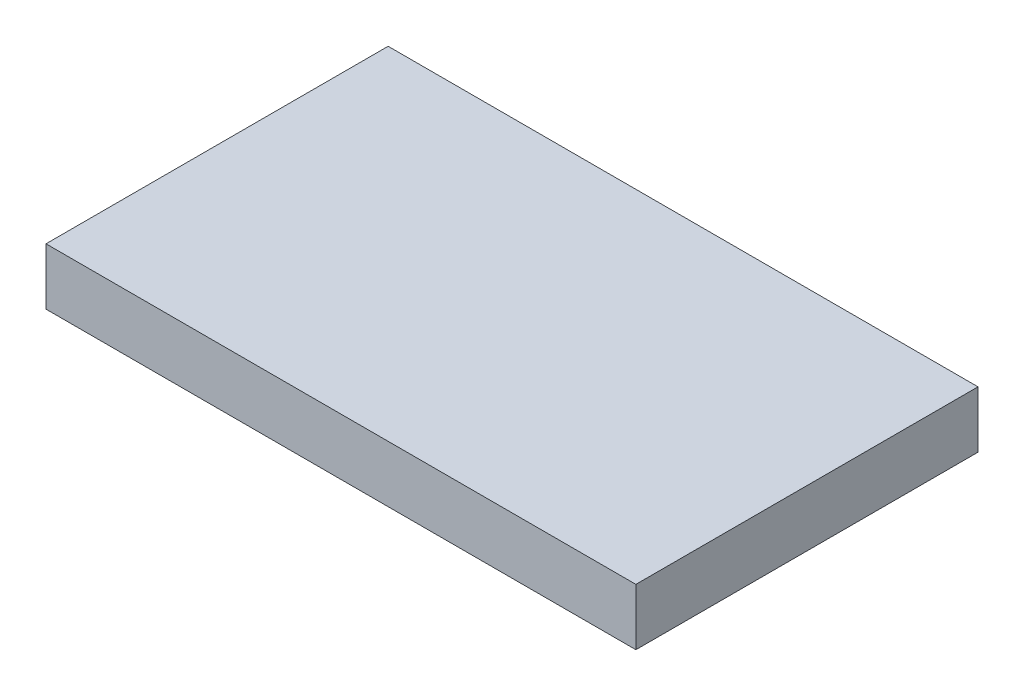
ISO-10303-21;
HEADER;
FILE_DESCRIPTION(('STEP AP214'),'2;1');
FILE_NAME('part.step','',(''),(''),'','','');
FILE_SCHEMA(('AUTOMOTIVE_DESIGN { 1 0 10303 214 1 1 1 1 }'));
ENDSEC;
DATA;
#1=APPLICATION_CONTEXT('core data for automotive mechanical design processes');
#2=APPLICATION_PROTOCOL_DEFINITION('international standard','automotive_design',2000,#1);
#3=PRODUCT_CONTEXT('',#1,'mechanical');
#4=PRODUCT('Part','Part','',(#3));
#5=PRODUCT_RELATED_PRODUCT_CATEGORY('part','',(#4));
#6=PRODUCT_DEFINITION_FORMATION('','',#4);
#7=PRODUCT_DEFINITION_CONTEXT('part definition',#1,'design');
#8=PRODUCT_DEFINITION('design','',#6,#7);
#9=PRODUCT_DEFINITION_SHAPE('','',#8);
#10=(LENGTH_UNIT() NAMED_UNIT(*) SI_UNIT(.MILLI.,.METRE.));
#11=(NAMED_UNIT(*) PLANE_ANGLE_UNIT() SI_UNIT($,.RADIAN.));
#12=(NAMED_UNIT(*) SI_UNIT($,.STERADIAN.) SOLID_ANGLE_UNIT());
#13=UNCERTAINTY_MEASURE_WITH_UNIT(LENGTH_MEASURE(1.E-05),#10,'distance_accuracy_value','');
#14=(GEOMETRIC_REPRESENTATION_CONTEXT(3) GLOBAL_UNCERTAINTY_ASSIGNED_CONTEXT((#13)) GLOBAL_UNIT_ASSIGNED_CONTEXT((#10,
#11,#12)) REPRESENTATION_CONTEXT('',''));
#15=CARTESIAN_POINT('',(0.,0.,0.));
#16=DIRECTION('',(0.,0.,1.));
#17=DIRECTION('',(1.,0.,0.));
#18=AXIS2_PLACEMENT_3D('',#15,#16,#17);
#19=CARTESIAN_POINT('',(-25.,4.8,14.5));
#20=DIRECTION('',(1.,0.,0.));
#21=DIRECTION('',(0.,0.,-1.));
#22=AXIS2_PLACEMENT_3D('',#19,#20,#21);
#23=PLANE('',#22);
#24=DIRECTION('',(0.,0.,1.));
#25=VECTOR('',#24,1.);
#26=CARTESIAN_POINT('',(-25.,0.,14.5));
#27=LINE('',#26,#25);
#28=CARTESIAN_POINT('',(-25.,0.,-14.5));
#29=VERTEX_POINT('',#28);
#30=CARTESIAN_POINT('',(-25.,0.,14.5));
#31=VERTEX_POINT('',#30);
#32=EDGE_CURVE('E98',#29,#31,#27,.T.);
#33=ORIENTED_EDGE('',*,*,#32,.T.);
#34=DIRECTION('',(0.,-1.,0.));
#35=VECTOR('',#34,1.);
#36=CARTESIAN_POINT('',(-25.,4.8,14.5));
#37=LINE('',#36,#35);
#38=CARTESIAN_POINT('',(-25.,4.8,14.5));
#39=VERTEX_POINT('',#38);
#40=EDGE_CURVE('E11',#39,#31,#37,.T.);
#41=ORIENTED_EDGE('',*,*,#40,.F.);
#42=DIRECTION('',(0.,0.,1.));
#43=VECTOR('',#42,1.);
#44=CARTESIAN_POINT('',(-25.,4.8,14.5));
#45=LINE('',#44,#43);
#46=CARTESIAN_POINT('',(-25.,4.8,-14.5));
#47=VERTEX_POINT('',#46);
#48=EDGE_CURVE('E86',#47,#39,#45,.T.);
#49=ORIENTED_EDGE('',*,*,#48,.F.);
#50=DIRECTION('',(0.,-1.,0.));
#51=VECTOR('',#50,1.);
#52=CARTESIAN_POINT('',(-25.,4.8,-14.5));
#53=LINE('',#52,#51);
#54=EDGE_CURVE('E94',#47,#29,#53,.T.);
#55=ORIENTED_EDGE('',*,*,#54,.T.);
#56=EDGE_LOOP('',(#33,#41,#49,#55));
#57=FACE_BOUND('',#56,.T.);
#58=ADVANCED_FACE('F35',(#57),#23,.F.);
#59=CARTESIAN_POINT('',(25.,4.8,14.5));
#60=DIRECTION('',(0.,0.,-1.));
#61=DIRECTION('',(-1.,0.,0.));
#62=AXIS2_PLACEMENT_3D('',#59,#60,#61);
#63=PLANE('',#62);
#64=DIRECTION('',(1.,0.,0.));
#65=VECTOR('',#64,1.);
#66=CARTESIAN_POINT('',(25.,0.,14.5));
#67=LINE('',#66,#65);
#68=CARTESIAN_POINT('',(25.,0.,14.5));
#69=VERTEX_POINT('',#68);
#70=EDGE_CURVE('E90',#31,#69,#67,.T.);
#71=ORIENTED_EDGE('',*,*,#70,.T.);
#72=DIRECTION('',(0.,-1.,0.));
#73=VECTOR('',#72,1.);
#74=CARTESIAN_POINT('',(25.,4.8,14.5));
#75=LINE('',#74,#73);
#76=CARTESIAN_POINT('',(25.,4.8,14.5));
#77=VERTEX_POINT('',#76);
#78=EDGE_CURVE('E43',#77,#69,#75,.T.);
#79=ORIENTED_EDGE('',*,*,#78,.F.);
#80=DIRECTION('',(1.,0.,0.));
#81=VECTOR('',#80,1.);
#82=CARTESIAN_POINT('',(25.,4.8,14.5));
#83=LINE('',#82,#81);
#84=EDGE_CURVE('E81',#39,#77,#83,.T.);
#85=ORIENTED_EDGE('',*,*,#84,.F.);
#86=ORIENTED_EDGE('',*,*,#40,.T.);
#87=EDGE_LOOP('',(#71,#79,#85,#86));
#88=FACE_BOUND('',#87,.T.);
#89=ADVANCED_FACE('F89',(#88),#63,.F.);
#90=CARTESIAN_POINT('',(25.,4.8,14.5));
#91=DIRECTION('',(-1.,0.,0.));
#92=DIRECTION('',(0.,0.,1.));
#93=AXIS2_PLACEMENT_3D('',#90,#91,#92);
#94=PLANE('',#93);
#95=DIRECTION('',(0.,0.,-1.));
#96=VECTOR('',#95,1.);
#97=CARTESIAN_POINT('',(25.,0.,14.5));
#98=LINE('',#97,#96);
#99=CARTESIAN_POINT('',(25.,0.,-14.5));
#100=VERTEX_POINT('',#99);
#101=EDGE_CURVE('E68',#69,#100,#98,.T.);
#102=ORIENTED_EDGE('',*,*,#101,.T.);
#103=DIRECTION('',(0.,-1.,0.));
#104=VECTOR('',#103,1.);
#105=CARTESIAN_POINT('',(25.,4.8,-14.5));
#106=LINE('',#105,#104);
#107=CARTESIAN_POINT('',(25.,4.8,-14.5));
#108=VERTEX_POINT('',#107);
#109=EDGE_CURVE('E91',#108,#100,#106,.T.);
#110=ORIENTED_EDGE('',*,*,#109,.F.);
#111=DIRECTION('',(0.,0.,-1.));
#112=VECTOR('',#111,1.);
#113=CARTESIAN_POINT('',(25.,4.8,14.5));
#114=LINE('',#113,#112);
#115=EDGE_CURVE('E84',#77,#108,#114,.T.);
#116=ORIENTED_EDGE('',*,*,#115,.F.);
#117=ORIENTED_EDGE('',*,*,#78,.T.);
#118=EDGE_LOOP('',(#102,#110,#116,#117));
#119=FACE_BOUND('',#118,.T.);
#120=ADVANCED_FACE('F92',(#119),#94,.F.);
#121=CARTESIAN_POINT('',(25.,4.8,-14.5));
#122=DIRECTION('',(0.,0.,1.));
#123=DIRECTION('',(1.,0.,0.));
#124=AXIS2_PLACEMENT_3D('',#121,#122,#123);
#125=PLANE('',#124);
#126=DIRECTION('',(-1.,0.,0.));
#127=VECTOR('',#126,1.);
#128=CARTESIAN_POINT('',(25.,0.,-14.5));
#129=LINE('',#128,#127);
#130=EDGE_CURVE('E74',#100,#29,#129,.T.);
#131=ORIENTED_EDGE('',*,*,#130,.T.);
#132=ORIENTED_EDGE('',*,*,#54,.F.);
#133=DIRECTION('',(-1.,0.,0.));
#134=VECTOR('',#133,1.);
#135=CARTESIAN_POINT('',(25.,4.8,-14.5));
#136=LINE('',#135,#134);
#137=EDGE_CURVE('E51',#108,#47,#136,.T.);
#138=ORIENTED_EDGE('',*,*,#137,.F.);
#139=ORIENTED_EDGE('',*,*,#109,.T.);
#140=EDGE_LOOP('',(#131,#132,#138,#139));
#141=FACE_BOUND('',#140,.T.);
#142=ADVANCED_FACE('F105',(#141),#125,.F.);
#143=CARTESIAN_POINT('',(0.,4.8,0.));
#144=DIRECTION('',(0.,1.,0.));
#145=DIRECTION('',(0.,0.,1.));
#146=AXIS2_PLACEMENT_3D('',#143,#144,#145);
#147=PLANE('',#146);
#148=ORIENTED_EDGE('',*,*,#48,.T.);
#149=ORIENTED_EDGE('',*,*,#84,.T.);
#150=ORIENTED_EDGE('',*,*,#115,.T.);
#151=ORIENTED_EDGE('',*,*,#137,.T.);
#152=EDGE_LOOP('',(#148,#149,#150,#151));
#153=FACE_BOUND('',#152,.T.);
#154=ADVANCED_FACE('F82',(#153),#147,.T.);
#155=CARTESIAN_POINT('',(0.,0.,0.));
#156=DIRECTION('',(0.,1.,0.));
#157=DIRECTION('',(0.,0.,1.));
#158=AXIS2_PLACEMENT_3D('',#155,#156,#157);
#159=PLANE('',#158);
#160=ORIENTED_EDGE('',*,*,#32,.F.);
#161=ORIENTED_EDGE('',*,*,#130,.F.);
#162=ORIENTED_EDGE('',*,*,#101,.F.);
#163=ORIENTED_EDGE('',*,*,#70,.F.);
#164=EDGE_LOOP('',(#160,#161,#162,#163));
#165=FACE_BOUND('',#164,.T.);
#166=ADVANCED_FACE('F108',(#165),#159,.F.);
#167=CLOSED_SHELL('',(#58,#89,#120,#142,#154,#166));
#168=MANIFOLD_SOLID_BREP('B2',#167);
#169=ADVANCED_BREP_SHAPE_REPRESENTATION('',(#18,#168),#14);
#170=SHAPE_DEFINITION_REPRESENTATION(#9,#169);
ENDSEC;
END-ISO-10303-21;
